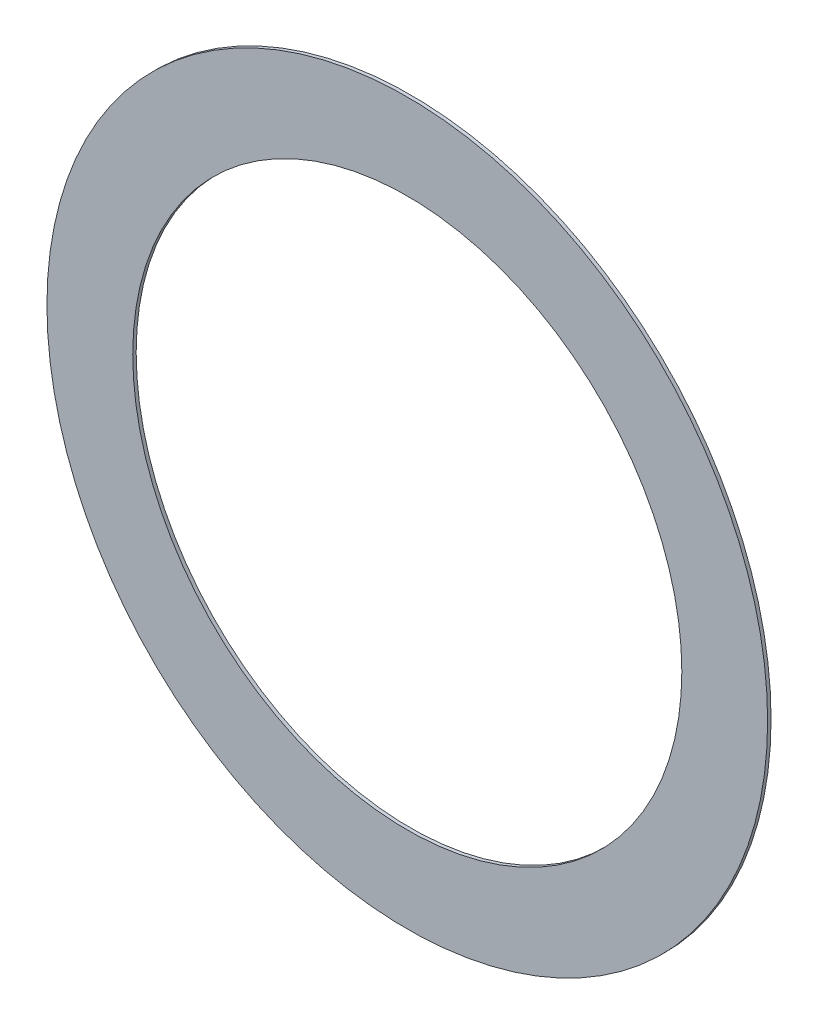
ISO-10303-21;
HEADER;
FILE_DESCRIPTION(('STEP AP214'),'2;1');
FILE_NAME('part.step','',(''),(''),'','','');
FILE_SCHEMA(('AUTOMOTIVE_DESIGN { 1 0 10303 214 1 1 1 1 }'));
ENDSEC;
DATA;
#1=APPLICATION_CONTEXT('core data for automotive mechanical design processes');
#2=APPLICATION_PROTOCOL_DEFINITION('international standard','automotive_design',2000,#1);
#3=PRODUCT_CONTEXT('',#1,'mechanical');
#4=PRODUCT('Part','Part','',(#3));
#5=PRODUCT_RELATED_PRODUCT_CATEGORY('part','',(#4));
#6=PRODUCT_DEFINITION_FORMATION('','',#4);
#7=PRODUCT_DEFINITION_CONTEXT('part definition',#1,'design');
#8=PRODUCT_DEFINITION('design','',#6,#7);
#9=PRODUCT_DEFINITION_SHAPE('','',#8);
#10=(LENGTH_UNIT() NAMED_UNIT(*) SI_UNIT(.MILLI.,.METRE.));
#11=(NAMED_UNIT(*) PLANE_ANGLE_UNIT() SI_UNIT($,.RADIAN.));
#12=(NAMED_UNIT(*) SI_UNIT($,.STERADIAN.) SOLID_ANGLE_UNIT());
#13=UNCERTAINTY_MEASURE_WITH_UNIT(LENGTH_MEASURE(1.E-05),#10,'distance_accuracy_value','');
#14=(GEOMETRIC_REPRESENTATION_CONTEXT(3) GLOBAL_UNCERTAINTY_ASSIGNED_CONTEXT((#13)) GLOBAL_UNIT_ASSIGNED_CONTEXT((#10,
#11,#12)) REPRESENTATION_CONTEXT('',''));
#15=CARTESIAN_POINT('',(0.,0.,0.));
#16=DIRECTION('',(0.,0.,1.));
#17=DIRECTION('',(1.,0.,0.));
#18=AXIS2_PLACEMENT_3D('',#15,#16,#17);
#19=CARTESIAN_POINT('',(0.,0.,0.01));
#20=DIRECTION('',(0.,0.,1.));
#21=DIRECTION('',(1.,0.,0.));
#22=AXIS2_PLACEMENT_3D('',#19,#20,#21);
#23=PLANE('',#22);
#24=CARTESIAN_POINT('',(7.85,-3.125,0.01));
#25=DIRECTION('',(0.,0.,1.));
#26=DIRECTION('',(1.,0.,0.));
#27=AXIS2_PLACEMENT_3D('',#24,#25,#26);
#28=CIRCLE('',#27,0.8);
#29=CARTESIAN_POINT('',(8.65,-3.125,0.01));
#30=VERTEX_POINT('',#29);
#31=EDGE_CURVE('E27',#30,#30,#28,.F.);
#32=ORIENTED_EDGE('',*,*,#31,.T.);
#33=EDGE_LOOP('',(#32));
#34=FACE_BOUND('',#33,.T.);
#35=CARTESIAN_POINT('',(7.85,-3.125,0.01));
#36=DIRECTION('',(0.,0.,1.));
#37=DIRECTION('',(1.,0.,0.));
#38=AXIS2_PLACEMENT_3D('',#35,#36,#37);
#39=CIRCLE('',#38,1.05);
#40=CARTESIAN_POINT('',(8.9,-3.125,0.01));
#41=VERTEX_POINT('',#40);
#42=EDGE_CURVE('E18',#41,#41,#39,.F.);
#43=ORIENTED_EDGE('',*,*,#42,.F.);
#44=EDGE_LOOP('',(#43));
#45=FACE_BOUND('',#44,.T.);
#46=ADVANCED_FACE('F15',(#34,#45),#23,.T.);
#47=CARTESIAN_POINT('',(7.85,-3.125,0.));
#48=DIRECTION('',(0.,0.,1.));
#49=DIRECTION('',(1.,0.,0.));
#50=AXIS2_PLACEMENT_3D('',#47,#48,#49);
#51=CYLINDRICAL_SURFACE('',#50,1.05);
#52=ORIENTED_EDGE('',*,*,#42,.T.);
#53=EDGE_LOOP('',(#52));
#54=FACE_BOUND('',#53,.T.);
#55=CARTESIAN_POINT('',(7.85,-3.125,0.));
#56=DIRECTION('',(0.,0.,1.));
#57=DIRECTION('',(1.,0.,0.));
#58=AXIS2_PLACEMENT_3D('',#55,#56,#57);
#59=CIRCLE('',#58,1.05);
#60=CARTESIAN_POINT('',(8.9,-3.125,0.));
#61=VERTEX_POINT('',#60);
#62=EDGE_CURVE('E22',#61,#61,#59,.T.);
#63=ORIENTED_EDGE('',*,*,#62,.T.);
#64=EDGE_LOOP('',(#63));
#65=FACE_BOUND('',#64,.T.);
#66=ADVANCED_FACE('F35',(#54,#65),#51,.T.);
#67=CARTESIAN_POINT('',(7.85,-3.125,0.));
#68=DIRECTION('',(0.,0.,1.));
#69=DIRECTION('',(1.,0.,0.));
#70=AXIS2_PLACEMENT_3D('',#67,#68,#69);
#71=CYLINDRICAL_SURFACE('',#70,0.8);
#72=ORIENTED_EDGE('',*,*,#31,.F.);
#73=EDGE_LOOP('',(#72));
#74=FACE_BOUND('',#73,.T.);
#75=CARTESIAN_POINT('',(7.85,-3.125,0.));
#76=DIRECTION('',(0.,0.,1.));
#77=DIRECTION('',(1.,0.,0.));
#78=AXIS2_PLACEMENT_3D('',#75,#76,#77);
#79=CIRCLE('',#78,0.8);
#80=CARTESIAN_POINT('',(8.65,-3.125,0.));
#81=VERTEX_POINT('',#80);
#82=EDGE_CURVE('E10',#81,#81,#79,.F.);
#83=ORIENTED_EDGE('',*,*,#82,.T.);
#84=EDGE_LOOP('',(#83));
#85=FACE_BOUND('',#84,.T.);
#86=ADVANCED_FACE('F43',(#74,#85),#71,.F.);
#87=CARTESIAN_POINT('',(0.,0.,0.));
#88=DIRECTION('',(0.,0.,1.));
#89=DIRECTION('',(1.,0.,0.));
#90=AXIS2_PLACEMENT_3D('',#87,#88,#89);
#91=PLANE('',#90);
#92=ORIENTED_EDGE('',*,*,#82,.F.);
#93=EDGE_LOOP('',(#92));
#94=FACE_BOUND('',#93,.T.);
#95=ORIENTED_EDGE('',*,*,#62,.F.);
#96=EDGE_LOOP('',(#95));
#97=FACE_BOUND('',#96,.T.);
#98=ADVANCED_FACE('F44',(#94,#97),#91,.F.);
#99=CLOSED_SHELL('',(#46,#66,#86,#98));
#100=MANIFOLD_SOLID_BREP('B1',#99);
#101=ADVANCED_BREP_SHAPE_REPRESENTATION('',(#18,#100),#14);
#102=SHAPE_DEFINITION_REPRESENTATION(#9,#101);
ENDSEC;
END-ISO-10303-21;
